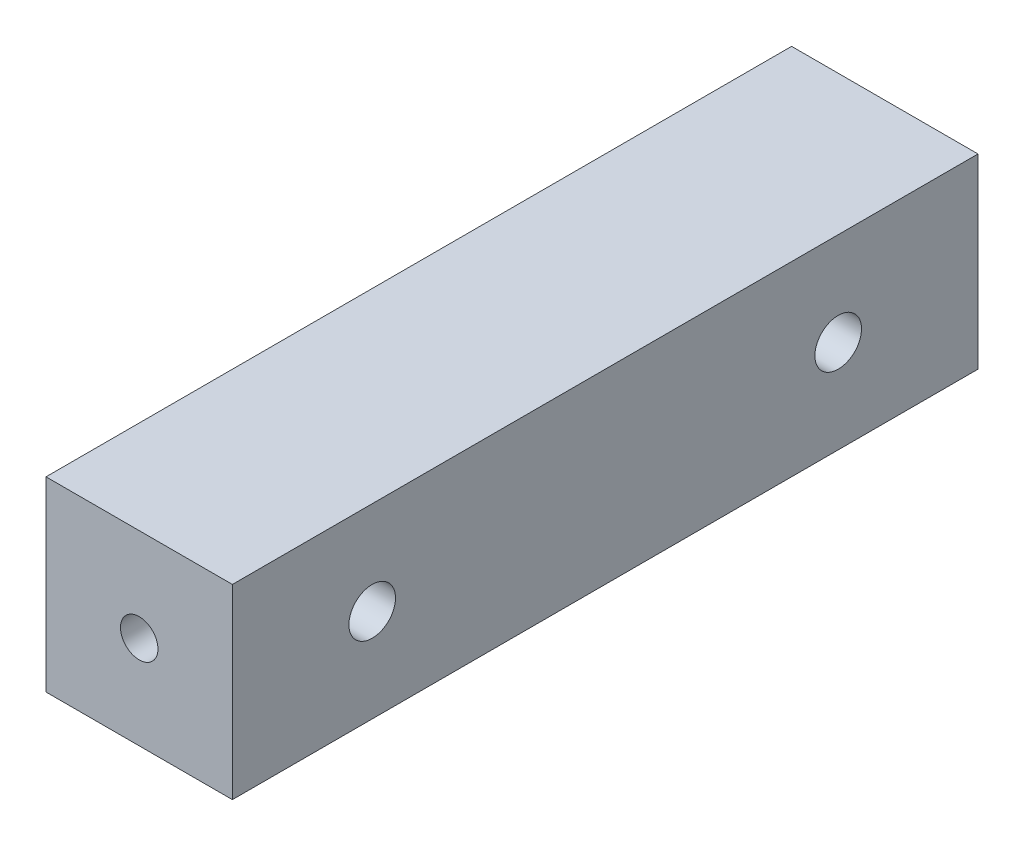
ISO-10303-21;
HEADER;
FILE_DESCRIPTION(('STEP AP214'),'2;1');
FILE_NAME('part.step','',(''),(''),'','','');
FILE_SCHEMA(('AUTOMOTIVE_DESIGN { 1 0 10303 214 1 1 1 1 }'));
ENDSEC;
DATA;
#1=APPLICATION_CONTEXT('core data for automotive mechanical design processes');
#2=APPLICATION_PROTOCOL_DEFINITION('international standard','automotive_design',2000,#1);
#3=PRODUCT_CONTEXT('',#1,'mechanical');
#4=PRODUCT('Part','Part','',(#3));
#5=PRODUCT_RELATED_PRODUCT_CATEGORY('part','',(#4));
#6=PRODUCT_DEFINITION_FORMATION('','',#4);
#7=PRODUCT_DEFINITION_CONTEXT('part definition',#1,'design');
#8=PRODUCT_DEFINITION('design','',#6,#7);
#9=PRODUCT_DEFINITION_SHAPE('','',#8);
#10=(LENGTH_UNIT() NAMED_UNIT(*) SI_UNIT(.MILLI.,.METRE.));
#11=(NAMED_UNIT(*) PLANE_ANGLE_UNIT() SI_UNIT($,.RADIAN.));
#12=(NAMED_UNIT(*) SI_UNIT($,.STERADIAN.) SOLID_ANGLE_UNIT());
#13=UNCERTAINTY_MEASURE_WITH_UNIT(LENGTH_MEASURE(1.E-05),#10,'distance_accuracy_value','');
#14=(GEOMETRIC_REPRESENTATION_CONTEXT(3) GLOBAL_UNCERTAINTY_ASSIGNED_CONTEXT((#13)) GLOBAL_UNIT_ASSIGNED_CONTEXT((#10,
#11,#12)) REPRESENTATION_CONTEXT('',''));
#15=CARTESIAN_POINT('',(0.,0.,0.));
#16=DIRECTION('',(0.,0.,1.));
#17=DIRECTION('',(1.,0.,0.));
#18=AXIS2_PLACEMENT_3D('',#15,#16,#17);
#19=CARTESIAN_POINT('',(12.7,-12.7,50.8));
#20=DIRECTION('',(-1.,0.,0.));
#21=DIRECTION('',(0.,0.,1.));
#22=AXIS2_PLACEMENT_3D('',#19,#20,#21);
#23=PLANE('',#22);
#24=CARTESIAN_POINT('',(12.7,0.,-31.75));
#25=DIRECTION('',(1.,0.,0.));
#26=DIRECTION('',(0.,0.,-1.));
#27=AXIS2_PLACEMENT_3D('',#24,#25,#26);
#28=CIRCLE('',#27,3.17500000000001);
#29=CARTESIAN_POINT('',(12.7,0.,-34.925));
#30=VERTEX_POINT('',#29);
#31=EDGE_CURVE('E128',#30,#30,#28,.T.);
#32=ORIENTED_EDGE('',*,*,#31,.F.);
#33=EDGE_LOOP('',(#32));
#34=FACE_BOUND('',#33,.T.);
#35=CARTESIAN_POINT('',(12.7,0.,31.75));
#36=DIRECTION('',(1.,0.,0.));
#37=DIRECTION('',(0.,0.,-1.));
#38=AXIS2_PLACEMENT_3D('',#35,#36,#37);
#39=CIRCLE('',#38,3.175);
#40=CARTESIAN_POINT('',(12.7,0.,28.575));
#41=VERTEX_POINT('',#40);
#42=EDGE_CURVE('E122',#41,#41,#39,.T.);
#43=ORIENTED_EDGE('',*,*,#42,.F.);
#44=EDGE_LOOP('',(#43));
#45=FACE_BOUND('',#44,.T.);
#46=DIRECTION('',(0.,1.,0.));
#47=VECTOR('',#46,1.);
#48=CARTESIAN_POINT('',(12.7,-12.7,-50.8));
#49=LINE('',#48,#47);
#50=CARTESIAN_POINT('',(12.7,-12.7,-50.8));
#51=VERTEX_POINT('',#50);
#52=CARTESIAN_POINT('',(12.7,12.7,-50.8));
#53=VERTEX_POINT('',#52);
#54=EDGE_CURVE('E96',#51,#53,#49,.T.);
#55=ORIENTED_EDGE('',*,*,#54,.T.);
#56=DIRECTION('',(0.,0.,-1.));
#57=VECTOR('',#56,1.);
#58=CARTESIAN_POINT('',(12.7,12.7,50.8));
#59=LINE('',#58,#57);
#60=CARTESIAN_POINT('',(12.7,12.7,50.8));
#61=VERTEX_POINT('',#60);
#62=EDGE_CURVE('E11',#61,#53,#59,.T.);
#63=ORIENTED_EDGE('',*,*,#62,.F.);
#64=DIRECTION('',(0.,1.,0.));
#65=VECTOR('',#64,1.);
#66=CARTESIAN_POINT('',(12.7,-12.7,50.8));
#67=LINE('',#66,#65);
#68=CARTESIAN_POINT('',(12.7,-12.7,50.8));
#69=VERTEX_POINT('',#68);
#70=EDGE_CURVE('E84',#69,#61,#67,.T.);
#71=ORIENTED_EDGE('',*,*,#70,.F.);
#72=DIRECTION('',(0.,0.,-1.));
#73=VECTOR('',#72,1.);
#74=CARTESIAN_POINT('',(12.7,-12.7,50.8));
#75=LINE('',#74,#73);
#76=EDGE_CURVE('E92',#69,#51,#75,.T.);
#77=ORIENTED_EDGE('',*,*,#76,.T.);
#78=EDGE_LOOP('',(#55,#63,#71,#77));
#79=FACE_BOUND('',#78,.T.);
#80=ADVANCED_FACE('F33',(#34,#45,#79),#23,.F.);
#81=CARTESIAN_POINT('',(-12.7,12.7,50.8));
#82=DIRECTION('',(0.,-1.,0.));
#83=DIRECTION('',(0.,0.,-1.));
#84=AXIS2_PLACEMENT_3D('',#81,#82,#83);
#85=PLANE('',#84);
#86=DIRECTION('',(-1.,0.,0.));
#87=VECTOR('',#86,1.);
#88=CARTESIAN_POINT('',(-12.7,12.7,-50.8));
#89=LINE('',#88,#87);
#90=CARTESIAN_POINT('',(-12.7,12.7,-50.8));
#91=VERTEX_POINT('',#90);
#92=EDGE_CURVE('E88',#53,#91,#89,.T.);
#93=ORIENTED_EDGE('',*,*,#92,.T.);
#94=DIRECTION('',(0.,0.,-1.));
#95=VECTOR('',#94,1.);
#96=CARTESIAN_POINT('',(-12.7,12.7,50.8));
#97=LINE('',#96,#95);
#98=CARTESIAN_POINT('',(-12.7,12.7,50.8));
#99=VERTEX_POINT('',#98);
#100=EDGE_CURVE('E41',#99,#91,#97,.T.);
#101=ORIENTED_EDGE('',*,*,#100,.F.);
#102=DIRECTION('',(-1.,0.,0.));
#103=VECTOR('',#102,1.);
#104=CARTESIAN_POINT('',(-12.7,12.7,50.8));
#105=LINE('',#104,#103);
#106=EDGE_CURVE('E79',#61,#99,#105,.T.);
#107=ORIENTED_EDGE('',*,*,#106,.F.);
#108=ORIENTED_EDGE('',*,*,#62,.T.);
#109=EDGE_LOOP('',(#93,#101,#107,#108));
#110=FACE_BOUND('',#109,.T.);
#111=ADVANCED_FACE('F87',(#110),#85,.F.);
#112=CARTESIAN_POINT('',(-12.7,-12.7,50.8));
#113=DIRECTION('',(1.,0.,0.));
#114=DIRECTION('',(0.,0.,-1.));
#115=AXIS2_PLACEMENT_3D('',#112,#113,#114);
#116=PLANE('',#115);
#117=CARTESIAN_POINT('',(-12.7,0.,-31.75));
#118=DIRECTION('',(1.,0.,0.));
#119=DIRECTION('',(0.,0.,-1.));
#120=AXIS2_PLACEMENT_3D('',#117,#118,#119);
#121=CIRCLE('',#120,3.17500000000001);
#122=CARTESIAN_POINT('',(-12.7,0.,-34.925));
#123=VERTEX_POINT('',#122);
#124=EDGE_CURVE('E125',#123,#123,#121,.T.);
#125=ORIENTED_EDGE('',*,*,#124,.T.);
#126=EDGE_LOOP('',(#125));
#127=FACE_BOUND('',#126,.T.);
#128=CARTESIAN_POINT('',(-12.7,0.,31.75));
#129=DIRECTION('',(1.,0.,0.));
#130=DIRECTION('',(0.,0.,-1.));
#131=AXIS2_PLACEMENT_3D('',#128,#129,#130);
#132=CIRCLE('',#131,3.175);
#133=CARTESIAN_POINT('',(-12.7,0.,28.575));
#134=VERTEX_POINT('',#133);
#135=EDGE_CURVE('E119',#134,#134,#132,.T.);
#136=ORIENTED_EDGE('',*,*,#135,.T.);
#137=EDGE_LOOP('',(#136));
#138=FACE_BOUND('',#137,.T.);
#139=DIRECTION('',(0.,-1.,0.));
#140=VECTOR('',#139,1.);
#141=CARTESIAN_POINT('',(-12.7,-12.7,-50.8));
#142=LINE('',#141,#140);
#143=CARTESIAN_POINT('',(-12.7,-12.7,-50.8));
#144=VERTEX_POINT('',#143);
#145=EDGE_CURVE('E66',#91,#144,#142,.T.);
#146=ORIENTED_EDGE('',*,*,#145,.T.);
#147=DIRECTION('',(0.,0.,-1.));
#148=VECTOR('',#147,1.);
#149=CARTESIAN_POINT('',(-12.7,-12.7,50.8));
#150=LINE('',#149,#148);
#151=CARTESIAN_POINT('',(-12.7,-12.7,50.8));
#152=VERTEX_POINT('',#151);
#153=EDGE_CURVE('E89',#152,#144,#150,.T.);
#154=ORIENTED_EDGE('',*,*,#153,.F.);
#155=DIRECTION('',(0.,-1.,0.));
#156=VECTOR('',#155,1.);
#157=CARTESIAN_POINT('',(-12.7,-12.7,50.8));
#158=LINE('',#157,#156);
#159=EDGE_CURVE('E82',#99,#152,#158,.T.);
#160=ORIENTED_EDGE('',*,*,#159,.F.);
#161=ORIENTED_EDGE('',*,*,#100,.T.);
#162=EDGE_LOOP('',(#146,#154,#160,#161));
#163=FACE_BOUND('',#162,.T.);
#164=ADVANCED_FACE('F90',(#127,#138,#163),#116,.F.);
#165=CARTESIAN_POINT('',(-12.7,-12.7,50.8));
#166=DIRECTION('',(0.,1.,0.));
#167=DIRECTION('',(0.,0.,1.));
#168=AXIS2_PLACEMENT_3D('',#165,#166,#167);
#169=PLANE('',#168);
#170=DIRECTION('',(1.,0.,0.));
#171=VECTOR('',#170,1.);
#172=CARTESIAN_POINT('',(-12.7,-12.7,-50.8));
#173=LINE('',#172,#171);
#174=EDGE_CURVE('E72',#144,#51,#173,.T.);
#175=ORIENTED_EDGE('',*,*,#174,.T.);
#176=ORIENTED_EDGE('',*,*,#76,.F.);
#177=DIRECTION('',(1.,0.,0.));
#178=VECTOR('',#177,1.);
#179=CARTESIAN_POINT('',(-12.7,-12.7,50.8));
#180=LINE('',#179,#178);
#181=EDGE_CURVE('E49',#152,#69,#180,.T.);
#182=ORIENTED_EDGE('',*,*,#181,.F.);
#183=ORIENTED_EDGE('',*,*,#153,.T.);
#184=EDGE_LOOP('',(#175,#176,#182,#183));
#185=FACE_BOUND('',#184,.T.);
#186=ADVANCED_FACE('F104',(#185),#169,.F.);
#187=CARTESIAN_POINT('',(0.,0.,50.8));
#188=DIRECTION('',(0.,0.,-1.));
#189=DIRECTION('',(-1.,0.,0.));
#190=AXIS2_PLACEMENT_3D('',#187,#188,#189);
#191=PLANE('',#190);
#192=CARTESIAN_POINT('',(0.,0.,50.8));
#193=DIRECTION('',(0.,0.,1.));
#194=DIRECTION('',(1.,0.,0.));
#195=AXIS2_PLACEMENT_3D('',#192,#193,#194);
#196=CIRCLE('',#195,2.5527);
#197=CARTESIAN_POINT('',(2.5527,0.,50.8));
#198=VERTEX_POINT('',#197);
#199=EDGE_CURVE('E110',#198,#198,#196,.T.);
#200=ORIENTED_EDGE('',*,*,#199,.F.);
#201=EDGE_LOOP('',(#200));
#202=FACE_BOUND('',#201,.T.);
#203=ORIENTED_EDGE('',*,*,#70,.T.);
#204=ORIENTED_EDGE('',*,*,#106,.T.);
#205=ORIENTED_EDGE('',*,*,#159,.T.);
#206=ORIENTED_EDGE('',*,*,#181,.T.);
#207=EDGE_LOOP('',(#203,#204,#205,#206));
#208=FACE_BOUND('',#207,.T.);
#209=ADVANCED_FACE('F80',(#202,#208),#191,.F.);
#210=CARTESIAN_POINT('',(0.,0.,-50.8));
#211=DIRECTION('',(0.,0.,-1.));
#212=DIRECTION('',(-1.,0.,0.));
#213=AXIS2_PLACEMENT_3D('',#210,#211,#212);
#214=PLANE('',#213);
#215=CARTESIAN_POINT('',(0.,0.,-50.8));
#216=DIRECTION('',(0.,0.,-1.));
#217=DIRECTION('',(-1.,0.,0.));
#218=AXIS2_PLACEMENT_3D('',#215,#216,#217);
#219=CIRCLE('',#218,2.5527);
#220=CARTESIAN_POINT('',(-2.5527,0.,-50.8));
#221=VERTEX_POINT('',#220);
#222=EDGE_CURVE('E116',#221,#221,#219,.T.);
#223=ORIENTED_EDGE('',*,*,#222,.F.);
#224=EDGE_LOOP('',(#223));
#225=FACE_BOUND('',#224,.T.);
#226=ORIENTED_EDGE('',*,*,#54,.F.);
#227=ORIENTED_EDGE('',*,*,#174,.F.);
#228=ORIENTED_EDGE('',*,*,#145,.F.);
#229=ORIENTED_EDGE('',*,*,#92,.F.);
#230=EDGE_LOOP('',(#226,#227,#228,#229));
#231=FACE_BOUND('',#230,.T.);
#232=ADVANCED_FACE('F107',(#225,#231),#214,.T.);
#233=CARTESIAN_POINT('',(0.,0.,38.1));
#234=DIRECTION('',(0.,0.,1.));
#235=DIRECTION('',(1.,0.,0.));
#236=AXIS2_PLACEMENT_3D('',#233,#234,#235);
#237=CYLINDRICAL_SURFACE('',#236,2.5527);
#238=CARTESIAN_POINT('',(0.,0.,38.1));
#239=DIRECTION('',(0.,0.,1.));
#240=DIRECTION('',(1.,0.,0.));
#241=AXIS2_PLACEMENT_3D('',#238,#239,#240);
#242=CIRCLE('',#241,2.5527);
#243=CARTESIAN_POINT('',(2.5527,0.,38.1));
#244=VERTEX_POINT('',#243);
#245=EDGE_CURVE('E99',#244,#244,#242,.T.);
#246=ORIENTED_EDGE('',*,*,#245,.F.);
#247=EDGE_LOOP('',(#246));
#248=FACE_BOUND('',#247,.T.);
#249=ORIENTED_EDGE('',*,*,#199,.T.);
#250=EDGE_LOOP('',(#249));
#251=FACE_BOUND('',#250,.T.);
#252=ADVANCED_FACE('F165',(#248,#251),#237,.F.);
#253=CARTESIAN_POINT('',(0.,0.,38.1));
#254=DIRECTION('',(0.,0.,1.));
#255=DIRECTION('',(1.,0.,0.));
#256=AXIS2_PLACEMENT_3D('',#253,#254,#255);
#257=PLANE('',#256);
#258=ORIENTED_EDGE('',*,*,#245,.T.);
#259=EDGE_LOOP('',(#258));
#260=FACE_BOUND('',#259,.T.);
#261=ADVANCED_FACE('F161',(#260),#257,.T.);
#262=CARTESIAN_POINT('',(0.,0.,-38.1));
#263=DIRECTION('',(0.,0.,-1.));
#264=DIRECTION('',(-1.,0.,0.));
#265=AXIS2_PLACEMENT_3D('',#262,#263,#264);
#266=CYLINDRICAL_SURFACE('',#265,2.5527);
#267=CARTESIAN_POINT('',(0.,0.,-38.1));
#268=DIRECTION('',(0.,0.,-1.));
#269=DIRECTION('',(-1.,0.,0.));
#270=AXIS2_PLACEMENT_3D('',#267,#268,#269);
#271=CIRCLE('',#270,2.5527);
#272=CARTESIAN_POINT('',(-2.5527,0.,-38.1));
#273=VERTEX_POINT('',#272);
#274=EDGE_CURVE('E113',#273,#273,#271,.T.);
#275=ORIENTED_EDGE('',*,*,#274,.F.);
#276=EDGE_LOOP('',(#275));
#277=FACE_BOUND('',#276,.T.);
#278=ORIENTED_EDGE('',*,*,#222,.T.);
#279=EDGE_LOOP('',(#278));
#280=FACE_BOUND('',#279,.T.);
#281=ADVANCED_FACE('F154',(#277,#280),#266,.F.);
#282=CARTESIAN_POINT('',(0.,0.,-38.1));
#283=DIRECTION('',(0.,0.,-1.));
#284=DIRECTION('',(-1.,0.,0.));
#285=AXIS2_PLACEMENT_3D('',#282,#283,#284);
#286=PLANE('',#285);
#287=ORIENTED_EDGE('',*,*,#274,.T.);
#288=EDGE_LOOP('',(#287));
#289=FACE_BOUND('',#288,.T.);
#290=ADVANCED_FACE('F148',(#289),#286,.T.);
#291=CARTESIAN_POINT('',(-12.7,0.,31.75));
#292=DIRECTION('',(1.,0.,0.));
#293=DIRECTION('',(0.,0.,-1.));
#294=AXIS2_PLACEMENT_3D('',#291,#292,#293);
#295=CYLINDRICAL_SURFACE('',#294,3.175);
#296=ORIENTED_EDGE('',*,*,#135,.F.);
#297=EDGE_LOOP('',(#296));
#298=FACE_BOUND('',#297,.T.);
#299=ORIENTED_EDGE('',*,*,#42,.T.);
#300=EDGE_LOOP('',(#299));
#301=FACE_BOUND('',#300,.T.);
#302=ADVANCED_FACE('F139',(#298,#301),#295,.F.);
#303=CARTESIAN_POINT('',(-12.7,0.,-31.75));
#304=DIRECTION('',(1.,0.,0.));
#305=DIRECTION('',(0.,0.,-1.));
#306=AXIS2_PLACEMENT_3D('',#303,#304,#305);
#307=CYLINDRICAL_SURFACE('',#306,3.17500000000001);
#308=ORIENTED_EDGE('',*,*,#124,.F.);
#309=EDGE_LOOP('',(#308));
#310=FACE_BOUND('',#309,.T.);
#311=ORIENTED_EDGE('',*,*,#31,.T.);
#312=EDGE_LOOP('',(#311));
#313=FACE_BOUND('',#312,.T.);
#314=ADVANCED_FACE('F136',(#310,#313),#307,.F.);
#315=CLOSED_SHELL('',(#80,#111,#164,#186,#209,#232,#252,#261,#281,#290,#302,#314));
#316=MANIFOLD_SOLID_BREP('B2',#315);
#317=ADVANCED_BREP_SHAPE_REPRESENTATION('',(#18,#316),#14);
#318=SHAPE_DEFINITION_REPRESENTATION(#9,#317);
ENDSEC;
END-ISO-10303-21;
